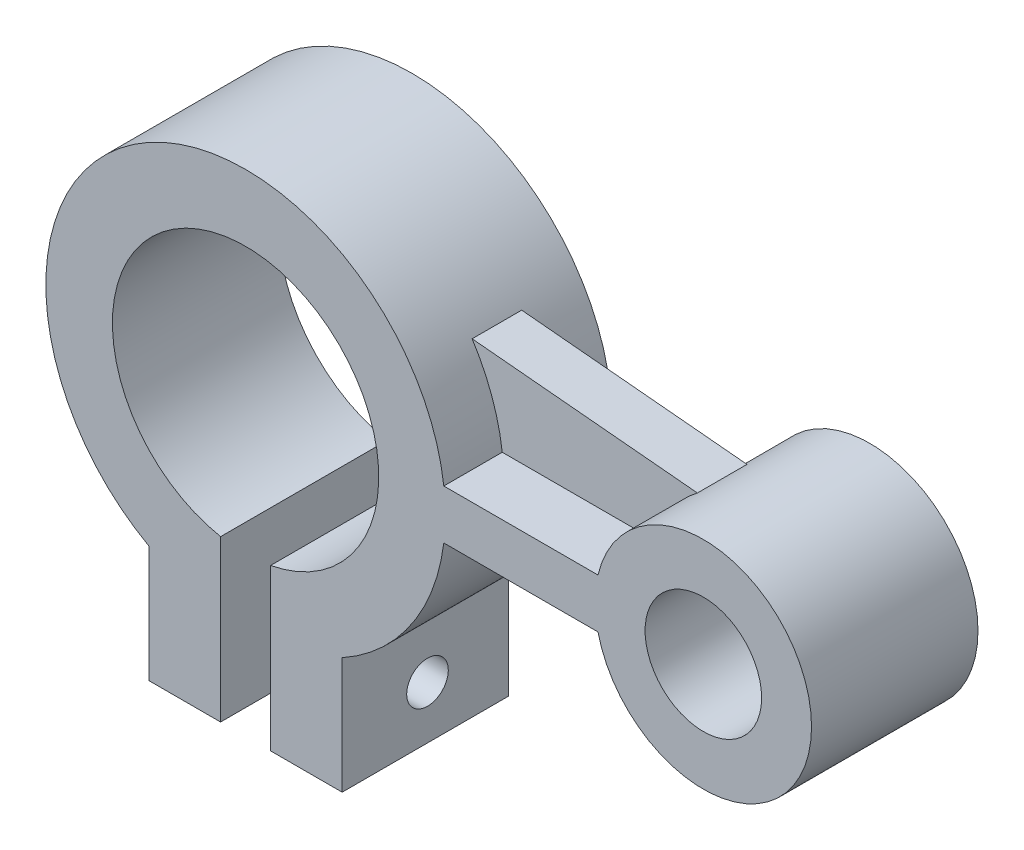
ISO-10303-21;
HEADER;
FILE_DESCRIPTION(('STEP AP214'),'2;1');
FILE_NAME('part.step','',(''),(''),'','','');
FILE_SCHEMA(('AUTOMOTIVE_DESIGN { 1 0 10303 214 1 1 1 1 }'));
ENDSEC;
DATA;
#1=APPLICATION_CONTEXT('core data for automotive mechanical design processes');
#2=APPLICATION_PROTOCOL_DEFINITION('international standard','automotive_design',2000,#1);
#3=PRODUCT_CONTEXT('',#1,'mechanical');
#4=PRODUCT('Part','Part','',(#3));
#5=PRODUCT_RELATED_PRODUCT_CATEGORY('part','',(#4));
#6=PRODUCT_DEFINITION_FORMATION('','',#4);
#7=PRODUCT_DEFINITION_CONTEXT('part definition',#1,'design');
#8=PRODUCT_DEFINITION('design','',#6,#7);
#9=PRODUCT_DEFINITION_SHAPE('','',#8);
#10=(LENGTH_UNIT() NAMED_UNIT(*) SI_UNIT(.MILLI.,.METRE.));
#11=(NAMED_UNIT(*) PLANE_ANGLE_UNIT() SI_UNIT($,.RADIAN.));
#12=(NAMED_UNIT(*) SI_UNIT($,.STERADIAN.) SOLID_ANGLE_UNIT());
#13=UNCERTAINTY_MEASURE_WITH_UNIT(LENGTH_MEASURE(1.E-05),#10,'distance_accuracy_value','');
#14=(GEOMETRIC_REPRESENTATION_CONTEXT(3) GLOBAL_UNCERTAINTY_ASSIGNED_CONTEXT((#13)) GLOBAL_UNIT_ASSIGNED_CONTEXT((#10,
#11,#12)) REPRESENTATION_CONTEXT('',''));
#15=CARTESIAN_POINT('',(0.,0.,0.));
#16=DIRECTION('',(0.,0.,1.));
#17=DIRECTION('',(1.,0.,0.));
#18=AXIS2_PLACEMENT_3D('',#15,#16,#17);
#19=CARTESIAN_POINT('',(0.,7.52347881235047,50.8));
#20=DIRECTION('',(0.,-1.,0.));
#21=DIRECTION('',(0.,0.,-1.));
#22=AXIS2_PLACEMENT_3D('',#19,#20,#21);
#23=PLANE('',#22);
#24=DIRECTION('',(-1.,0.,0.));
#25=VECTOR('',#24,1.);
#26=CARTESIAN_POINT('',(0.,7.52347881235047,17.8378913555939));
#27=LINE('',#26,#25);
#28=CARTESIAN_POINT('',(57.7043388095814,7.52347881235047,17.8378913555939));
#29=VERTEX_POINT('',#28);
#30=CARTESIAN_POINT('',(10.6497760884348,7.52347881235047,17.8378913555939));
#31=VERTEX_POINT('',#30);
#32=EDGE_CURVE('E310',#29,#31,#27,.T.);
#33=ORIENTED_EDGE('',*,*,#32,.F.);
#34=DIRECTION('',(0.,0.,-1.));
#35=VECTOR('',#34,1.);
#36=CARTESIAN_POINT('',(57.7043388095814,7.52347881235047,50.8));
#37=LINE('',#36,#35);
#38=CARTESIAN_POINT('',(57.7043388095814,7.52347881235047,0.));
#39=VERTEX_POINT('',#38);
#40=EDGE_CURVE('E237',#29,#39,#37,.T.);
#41=ORIENTED_EDGE('',*,*,#40,.T.);
#42=DIRECTION('',(-1.,0.,0.));
#43=VECTOR('',#42,1.);
#44=CARTESIAN_POINT('',(0.,7.52347881235047,0.));
#45=LINE('',#44,#43);
#46=CARTESIAN_POINT('',(10.6497760884348,7.52347881235047,0.));
#47=VERTEX_POINT('',#46);
#48=EDGE_CURVE('E270',#39,#47,#45,.T.);
#49=ORIENTED_EDGE('',*,*,#48,.T.);
#50=DIRECTION('',(0.,0.,-1.));
#51=VECTOR('',#50,1.);
#52=CARTESIAN_POINT('',(10.6497760884348,7.52347881235047,50.8));
#53=LINE('',#52,#51);
#54=EDGE_CURVE('E207',#31,#47,#53,.T.);
#55=ORIENTED_EDGE('',*,*,#54,.F.);
#56=EDGE_LOOP('',(#33,#41,#49,#55));
#57=FACE_BOUND('',#56,.T.);
#58=ADVANCED_FACE('F37',(#57),#23,.F.);
#59=DIRECTION('',(1.,0.,0.));
#60=VECTOR('',#59,1.);
#61=CARTESIAN_POINT('',(0.,7.52347881235047,32.9621086444061));
#62=LINE('',#61,#60);
#63=CARTESIAN_POINT('',(10.6497760884348,7.52347881235047,32.9621086444061));
#64=VERTEX_POINT('',#63);
#65=CARTESIAN_POINT('',(57.7043388095814,7.52347881235047,32.9621086444061));
#66=VERTEX_POINT('',#65);
#67=EDGE_CURVE('E192',#64,#66,#62,.T.);
#68=ORIENTED_EDGE('',*,*,#67,.F.);
#69=CARTESIAN_POINT('',(10.6497760884348,7.52347881235047,50.8));
#70=VERTEX_POINT('',#69);
#71=EDGE_CURVE('E204',#70,#64,#53,.T.);
#72=ORIENTED_EDGE('',*,*,#71,.F.);
#73=DIRECTION('',(-1.,0.,0.));
#74=VECTOR('',#73,1.);
#75=CARTESIAN_POINT('',(0.,7.52347881235047,50.8));
#76=LINE('',#75,#74);
#77=CARTESIAN_POINT('',(57.7043388095814,7.52347881235047,50.8));
#78=VERTEX_POINT('',#77);
#79=EDGE_CURVE('E304',#78,#70,#76,.T.);
#80=ORIENTED_EDGE('',*,*,#79,.F.);
#81=EDGE_CURVE('E235',#78,#66,#37,.T.);
#82=ORIENTED_EDGE('',*,*,#81,.T.);
#83=EDGE_LOOP('',(#68,#72,#80,#82));
#84=FACE_BOUND('',#83,.T.);
#85=ADVANCED_FACE('F407',(#84),#23,.F.);
#86=CARTESIAN_POINT('',(-49.844181184669,0.,50.8));
#87=DIRECTION('',(0.,0.,-1.));
#88=DIRECTION('',(-1.,0.,0.));
#89=AXIS2_PLACEMENT_3D('',#86,#87,#88);
#90=CYLINDRICAL_SURFACE('',#89,60.96);
#91=DIRECTION('',(0.,0.,-1.));
#92=VECTOR('',#91,1.);
#93=CARTESIAN_POINT('',(1.46045937437501,32.9234788123505,50.8));
#94=LINE('',#93,#92);
#95=CARTESIAN_POINT('',(1.46045937437501,32.9234788123505,17.8378913555939));
#96=VERTEX_POINT('',#95);
#97=CARTESIAN_POINT('',(1.46045937437501,32.9234788123505,32.9621086444061));
#98=VERTEX_POINT('',#97);
#99=EDGE_CURVE('E11',#96,#98,#94,.F.);
#100=ORIENTED_EDGE('',*,*,#99,.F.);
#101=CARTESIAN_POINT('',(-49.844181184669,0.,17.8378913555939));
#102=DIRECTION('',(0.,0.,1.));
#103=DIRECTION('',(1.,0.,0.));
#104=AXIS2_PLACEMENT_3D('',#101,#102,#103);
#105=CIRCLE('',#104,60.96);
#106=EDGE_CURVE('E57',#31,#96,#105,.T.);
#107=ORIENTED_EDGE('',*,*,#106,.F.);
#108=ORIENTED_EDGE('',*,*,#54,.T.);
#109=CARTESIAN_POINT('',(-49.844181184669,0.,0.));
#110=DIRECTION('',(0.,0.,1.));
#111=DIRECTION('',(1.,0.,0.));
#112=AXIS2_PLACEMENT_3D('',#109,#110,#111);
#113=CIRCLE('',#112,60.96);
#114=CARTESIAN_POINT('',(-79.3200634134683,-53.3600409185933,0.));
#115=VERTEX_POINT('',#114);
#116=EDGE_CURVE('E268',#47,#115,#113,.T.);
#117=ORIENTED_EDGE('',*,*,#116,.T.);
#118=DIRECTION('',(0.,0.,-1.));
#119=VECTOR('',#118,1.);
#120=CARTESIAN_POINT('',(-79.3200634134683,-53.3600409185933,50.8));
#121=LINE('',#120,#119);
#122=CARTESIAN_POINT('',(-79.3200634134683,-53.3600409185933,50.8));
#123=VERTEX_POINT('',#122);
#124=EDGE_CURVE('E210',#123,#115,#121,.T.);
#125=ORIENTED_EDGE('',*,*,#124,.F.);
#126=CARTESIAN_POINT('',(-49.844181184669,0.,50.8));
#127=DIRECTION('',(0.,0.,1.));
#128=DIRECTION('',(1.,0.,0.));
#129=AXIS2_PLACEMENT_3D('',#126,#127,#128);
#130=CIRCLE('',#129,60.96);
#131=EDGE_CURVE('E302',#70,#123,#130,.T.);
#132=ORIENTED_EDGE('',*,*,#131,.F.);
#133=ORIENTED_EDGE('',*,*,#71,.T.);
#134=CARTESIAN_POINT('',(-49.844181184669,0.,32.9621086444061));
#135=DIRECTION('',(0.,0.,-1.));
#136=DIRECTION('',(-1.,0.,0.));
#137=AXIS2_PLACEMENT_3D('',#134,#135,#136);
#138=CIRCLE('',#137,60.96);
#139=EDGE_CURVE('E322',#98,#64,#138,.T.);
#140=ORIENTED_EDGE('',*,*,#139,.F.);
#141=EDGE_LOOP('',(#100,#107,#108,#117,#125,#132,#133,#140));
#142=FACE_BOUND('',#141,.T.);
#143=ADVANCED_FACE('F399',(#142),#90,.T.);
#144=CARTESIAN_POINT('',(-49.844181184669,0.,50.8));
#145=DIRECTION('',(0.,0.,-1.));
#146=DIRECTION('',(-1.,0.,0.));
#147=AXIS2_PLACEMENT_3D('',#144,#145,#146);
#148=CYLINDRICAL_SURFACE('',#147,60.96);
#149=CARTESIAN_POINT('',(-49.844181184669,0.,17.8378913555939));
#150=DIRECTION('',(0.,0.,1.));
#151=DIRECTION('',(1.,0.,0.));
#152=AXIS2_PLACEMENT_3D('',#149,#150,#151);
#153=CIRCLE('',#152,60.96);
#154=CARTESIAN_POINT('',(8.43576039240802,-17.8765211876495,17.8378913555939));
#155=VERTEX_POINT('',#154);
#156=CARTESIAN_POINT('',(10.6497760884348,-7.52347881235047,17.8378913555939));
#157=VERTEX_POINT('',#156);
#158=EDGE_CURVE('E313',#155,#157,#153,.T.);
#159=ORIENTED_EDGE('',*,*,#158,.F.);
#160=DIRECTION('',(0.,0.,-1.));
#161=VECTOR('',#160,1.);
#162=CARTESIAN_POINT('',(8.43576039240802,-17.8765211876495,50.8));
#163=LINE('',#162,#161);
#164=CARTESIAN_POINT('',(8.43576039240802,-17.8765211876495,32.9621086444061));
#165=VERTEX_POINT('',#164);
#166=EDGE_CURVE('E325',#155,#165,#163,.F.);
#167=ORIENTED_EDGE('',*,*,#166,.T.);
#168=CARTESIAN_POINT('',(-49.844181184669,0.,32.9621086444061));
#169=DIRECTION('',(0.,0.,-1.));
#170=DIRECTION('',(-1.,0.,0.));
#171=AXIS2_PLACEMENT_3D('',#168,#169,#170);
#172=CIRCLE('',#171,60.96);
#173=CARTESIAN_POINT('',(10.6497760884348,-7.52347881235047,32.9621086444061));
#174=VERTEX_POINT('',#173);
#175=EDGE_CURVE('E318',#174,#165,#172,.T.);
#176=ORIENTED_EDGE('',*,*,#175,.F.);
#177=DIRECTION('',(0.,0.,-1.));
#178=VECTOR('',#177,1.);
#179=CARTESIAN_POINT('',(10.6497760884348,-7.52347881235047,50.8));
#180=LINE('',#179,#178);
#181=CARTESIAN_POINT('',(10.6497760884348,-7.52347881235047,50.8));
#182=VERTEX_POINT('',#181);
#183=EDGE_CURVE('E227',#182,#174,#180,.T.);
#184=ORIENTED_EDGE('',*,*,#183,.F.);
#185=CARTESIAN_POINT('',(-49.844181184669,0.,50.8));
#186=DIRECTION('',(0.,0.,1.));
#187=DIRECTION('',(1.,0.,0.));
#188=AXIS2_PLACEMENT_3D('',#185,#186,#187);
#189=CIRCLE('',#188,60.96);
#190=CARTESIAN_POINT('',(-20.3682989558698,-53.3600409185933,50.8));
#191=VERTEX_POINT('',#190);
#192=EDGE_CURVE('E281',#191,#182,#189,.T.);
#193=ORIENTED_EDGE('',*,*,#192,.F.);
#194=DIRECTION('',(0.,0.,-1.));
#195=VECTOR('',#194,1.);
#196=CARTESIAN_POINT('',(-20.3682989558698,-53.3600409185933,50.8));
#197=LINE('',#196,#195);
#198=CARTESIAN_POINT('',(-20.3682989558698,-53.3600409185933,0.));
#199=VERTEX_POINT('',#198);
#200=EDGE_CURVE('E225',#191,#199,#197,.T.);
#201=ORIENTED_EDGE('',*,*,#200,.T.);
#202=CARTESIAN_POINT('',(-49.844181184669,0.,0.));
#203=DIRECTION('',(0.,0.,1.));
#204=DIRECTION('',(1.,0.,0.));
#205=AXIS2_PLACEMENT_3D('',#202,#203,#204);
#206=CIRCLE('',#205,60.96);
#207=CARTESIAN_POINT('',(10.6497760884348,-7.52347881235047,0.));
#208=VERTEX_POINT('',#207);
#209=EDGE_CURVE('E244',#199,#208,#206,.T.);
#210=ORIENTED_EDGE('',*,*,#209,.T.);
#211=EDGE_CURVE('E230',#157,#208,#180,.T.);
#212=ORIENTED_EDGE('',*,*,#211,.F.);
#213=EDGE_LOOP('',(#159,#167,#176,#184,#193,#201,#210,#212));
#214=FACE_BOUND('',#213,.T.);
#215=ADVANCED_FACE('F367',(#214),#148,.T.);
#216=CARTESIAN_POINT('',(0.,-7.52347881235047,50.8));
#217=DIRECTION('',(0.,-1.,0.));
#218=DIRECTION('',(0.,0.,-1.));
#219=AXIS2_PLACEMENT_3D('',#216,#217,#218);
#220=PLANE('',#219);
#221=DIRECTION('',(0.,0.,-1.));
#222=VECTOR('',#221,1.);
#223=CARTESIAN_POINT('',(57.7043388095814,-7.52347881235047,50.8));
#224=LINE('',#223,#222);
#225=CARTESIAN_POINT('',(57.7043388095814,-7.52347881235047,17.8378913555939));
#226=VERTEX_POINT('',#225);
#227=CARTESIAN_POINT('',(57.7043388095814,-7.52347881235047,0.));
#228=VERTEX_POINT('',#227);
#229=EDGE_CURVE('E234',#226,#228,#224,.T.);
#230=ORIENTED_EDGE('',*,*,#229,.F.);
#231=DIRECTION('',(-1.,0.,0.));
#232=VECTOR('',#231,1.);
#233=CARTESIAN_POINT('',(0.,-7.52347881235047,17.8378913555939));
#234=LINE('',#233,#232);
#235=EDGE_CURVE('E315',#226,#157,#234,.T.);
#236=ORIENTED_EDGE('',*,*,#235,.T.);
#237=ORIENTED_EDGE('',*,*,#211,.T.);
#238=DIRECTION('',(-1.,0.,0.));
#239=VECTOR('',#238,1.);
#240=CARTESIAN_POINT('',(0.,-7.52347881235047,0.));
#241=LINE('',#240,#239);
#242=EDGE_CURVE('E241',#228,#208,#241,.T.);
#243=ORIENTED_EDGE('',*,*,#242,.F.);
#244=EDGE_LOOP('',(#230,#236,#237,#243));
#245=FACE_BOUND('',#244,.T.);
#246=ADVANCED_FACE('F419',(#245),#220,.T.);
#247=ORIENTED_EDGE('',*,*,#183,.T.);
#248=DIRECTION('',(1.,0.,0.));
#249=VECTOR('',#248,1.);
#250=CARTESIAN_POINT('',(0.,-7.52347881235047,32.9621086444061));
#251=LINE('',#250,#249);
#252=CARTESIAN_POINT('',(57.7043388095814,-7.52347881235047,32.9621086444061));
#253=VERTEX_POINT('',#252);
#254=EDGE_CURVE('E320',#174,#253,#251,.T.);
#255=ORIENTED_EDGE('',*,*,#254,.T.);
#256=CARTESIAN_POINT('',(57.7043388095814,-7.52347881235047,50.8));
#257=VERTEX_POINT('',#256);
#258=EDGE_CURVE('E231',#257,#253,#224,.T.);
#259=ORIENTED_EDGE('',*,*,#258,.F.);
#260=DIRECTION('',(-1.,0.,0.));
#261=VECTOR('',#260,1.);
#262=CARTESIAN_POINT('',(0.,-7.52347881235047,50.8));
#263=LINE('',#262,#261);
#264=EDGE_CURVE('E278',#257,#182,#263,.T.);
#265=ORIENTED_EDGE('',*,*,#264,.T.);
#266=EDGE_LOOP('',(#247,#255,#259,#265));
#267=FACE_BOUND('',#266,.T.);
#268=ADVANCED_FACE('F410',(#267),#220,.T.);
#269=CARTESIAN_POINT('',(89.8558188153309,0.,50.8));
#270=DIRECTION('',(0.,0.,-1.));
#271=DIRECTION('',(-1.,0.,0.));
#272=AXIS2_PLACEMENT_3D('',#269,#270,#271);
#273=CYLINDRICAL_SURFACE('',#272,33.02);
#274=CARTESIAN_POINT('',(89.8558188153309,0.,17.8378913555939));
#275=DIRECTION('',(0.,0.,1.));
#276=DIRECTION('',(1.,0.,0.));
#277=AXIS2_PLACEMENT_3D('',#274,#275,#276);
#278=CIRCLE('',#277,33.02);
#279=CARTESIAN_POINT('',(70.2103319318255,26.5400686719159,17.8378913555939));
#280=VERTEX_POINT('',#279);
#281=EDGE_CURVE('E45',#280,#29,#278,.T.);
#282=ORIENTED_EDGE('',*,*,#281,.F.);
#283=DIRECTION('',(0.,0.,-1.));
#284=VECTOR('',#283,1.);
#285=CARTESIAN_POINT('',(70.2103319318255,26.5400686719159,50.8));
#286=LINE('',#285,#284);
#287=CARTESIAN_POINT('',(70.2103319318255,26.5400686719159,32.9621086444061));
#288=VERTEX_POINT('',#287);
#289=EDGE_CURVE('E172',#288,#280,#286,.T.);
#290=ORIENTED_EDGE('',*,*,#289,.F.);
#291=CARTESIAN_POINT('',(89.8558188153309,0.,32.9621086444061));
#292=DIRECTION('',(0.,0.,-1.));
#293=DIRECTION('',(-1.,0.,0.));
#294=AXIS2_PLACEMENT_3D('',#291,#292,#293);
#295=CIRCLE('',#294,33.02);
#296=EDGE_CURVE('E185',#66,#288,#295,.T.);
#297=ORIENTED_EDGE('',*,*,#296,.F.);
#298=ORIENTED_EDGE('',*,*,#81,.F.);
#299=CARTESIAN_POINT('',(89.8558188153309,0.,50.8));
#300=DIRECTION('',(0.,0.,1.));
#301=DIRECTION('',(1.,0.,0.));
#302=AXIS2_PLACEMENT_3D('',#299,#300,#301);
#303=CIRCLE('',#302,33.02);
#304=EDGE_CURVE('E276',#257,#78,#303,.T.);
#305=ORIENTED_EDGE('',*,*,#304,.F.);
#306=ORIENTED_EDGE('',*,*,#258,.T.);
#307=CARTESIAN_POINT('',(62.0934271635385,-17.8765211876495,32.9621086444061));
#308=VERTEX_POINT('',#307);
#309=EDGE_CURVE('E194',#308,#253,#295,.T.);
#310=ORIENTED_EDGE('',*,*,#309,.F.);
#311=DIRECTION('',(0.,0.,-1.));
#312=VECTOR('',#311,1.);
#313=CARTESIAN_POINT('',(62.0934271635385,-17.8765211876495,50.8));
#314=LINE('',#313,#312);
#315=CARTESIAN_POINT('',(62.0934271635385,-17.8765211876495,17.8378913555939));
#316=VERTEX_POINT('',#315);
#317=EDGE_CURVE('E197',#308,#316,#314,.T.);
#318=ORIENTED_EDGE('',*,*,#317,.T.);
#319=EDGE_CURVE('E189',#226,#316,#278,.T.);
#320=ORIENTED_EDGE('',*,*,#319,.F.);
#321=ORIENTED_EDGE('',*,*,#229,.T.);
#322=CARTESIAN_POINT('',(89.8558188153309,0.,0.));
#323=DIRECTION('',(0.,0.,1.));
#324=DIRECTION('',(1.,0.,0.));
#325=AXIS2_PLACEMENT_3D('',#322,#323,#324);
#326=CIRCLE('',#325,33.02);
#327=EDGE_CURVE('E238',#228,#39,#326,.T.);
#328=ORIENTED_EDGE('',*,*,#327,.T.);
#329=ORIENTED_EDGE('',*,*,#40,.F.);
#330=EDGE_LOOP('',(#282,#290,#297,#298,#305,#306,#310,#318,#320,#321,#328,#329));
#331=FACE_BOUND('',#330,.T.);
#332=ADVANCED_FACE('F183',(#331),#273,.T.);
#333=CARTESIAN_POINT('',(-79.3200634134683,0.,50.8));
#334=DIRECTION('',(1.,0.,0.));
#335=DIRECTION('',(0.,0.,-1.));
#336=AXIS2_PLACEMENT_3D('',#333,#334,#335);
#337=PLANE('',#336);
#338=CARTESIAN_POINT('',(-79.3200634134683,-72.866633353911,24.7622273671606));
#339=DIRECTION('',(1.,0.,0.));
#340=DIRECTION('',(0.,0.,-1.));
#341=AXIS2_PLACEMENT_3D('',#338,#339,#340);
#342=CIRCLE('',#341,6.35);
#343=CARTESIAN_POINT('',(-79.3200634134683,-72.866633353911,18.4122273671606));
#344=VERTEX_POINT('',#343);
#345=EDGE_CURVE('E179',#344,#344,#342,.T.);
#346=ORIENTED_EDGE('',*,*,#345,.T.);
#347=EDGE_LOOP('',(#346));
#348=FACE_BOUND('',#347,.T.);
#349=DIRECTION('',(0.,-1.,0.));
#350=VECTOR('',#349,1.);
#351=CARTESIAN_POINT('',(-79.3200634134683,0.,0.));
#352=LINE('',#351,#350);
#353=CARTESIAN_POINT('',(-79.3200634134683,-88.9200409185933,0.));
#354=VERTEX_POINT('',#353);
#355=EDGE_CURVE('E265',#115,#354,#352,.T.);
#356=ORIENTED_EDGE('',*,*,#355,.T.);
#357=DIRECTION('',(0.,0.,-1.));
#358=VECTOR('',#357,1.);
#359=CARTESIAN_POINT('',(-79.3200634134683,-88.9200409185933,50.8));
#360=LINE('',#359,#358);
#361=CARTESIAN_POINT('',(-79.3200634134683,-88.9200409185933,50.8));
#362=VERTEX_POINT('',#361);
#363=EDGE_CURVE('E213',#362,#354,#360,.T.);
#364=ORIENTED_EDGE('',*,*,#363,.F.);
#365=DIRECTION('',(0.,-1.,0.));
#366=VECTOR('',#365,1.);
#367=CARTESIAN_POINT('',(-79.3200634134683,0.,50.8));
#368=LINE('',#367,#366);
#369=EDGE_CURVE('E300',#123,#362,#368,.T.);
#370=ORIENTED_EDGE('',*,*,#369,.F.);
#371=ORIENTED_EDGE('',*,*,#124,.T.);
#372=EDGE_LOOP('',(#356,#364,#370,#371));
#373=FACE_BOUND('',#372,.T.);
#374=ADVANCED_FACE('F397',(#348,#373),#337,.F.);
#375=CARTESIAN_POINT('',(0.,-88.9200409185933,50.8));
#376=DIRECTION('',(0.,-1.,0.));
#377=DIRECTION('',(0.,0.,-1.));
#378=AXIS2_PLACEMENT_3D('',#375,#376,#377);
#379=PLANE('',#378);
#380=DIRECTION('',(-1.,0.,0.));
#381=VECTOR('',#380,1.);
#382=CARTESIAN_POINT('',(0.,-88.9200409185933,0.));
#383=LINE('',#382,#381);
#384=CARTESIAN_POINT('',(-57.4705375175018,-88.9200409185933,0.));
#385=VERTEX_POINT('',#384);
#386=EDGE_CURVE('E262',#385,#354,#383,.T.);
#387=ORIENTED_EDGE('',*,*,#386,.F.);
#388=DIRECTION('',(0.,0.,-1.));
#389=VECTOR('',#388,1.);
#390=CARTESIAN_POINT('',(-57.4705375175018,-88.9200409185933,50.8));
#391=LINE('',#390,#389);
#392=CARTESIAN_POINT('',(-57.4705375175018,-88.9200409185933,50.8));
#393=VERTEX_POINT('',#392);
#394=EDGE_CURVE('E215',#393,#385,#391,.T.);
#395=ORIENTED_EDGE('',*,*,#394,.F.);
#396=DIRECTION('',(-1.,0.,0.));
#397=VECTOR('',#396,1.);
#398=CARTESIAN_POINT('',(0.,-88.9200409185933,50.8));
#399=LINE('',#398,#397);
#400=EDGE_CURVE('E297',#393,#362,#399,.T.);
#401=ORIENTED_EDGE('',*,*,#400,.T.);
#402=ORIENTED_EDGE('',*,*,#363,.T.);
#403=EDGE_LOOP('',(#387,#395,#401,#402));
#404=FACE_BOUND('',#403,.T.);
#405=ADVANCED_FACE('F392',(#404),#379,.T.);
#406=CARTESIAN_POINT('',(-57.4705375175018,0.,50.8));
#407=DIRECTION('',(1.,0.,0.));
#408=DIRECTION('',(0.,0.,-1.));
#409=AXIS2_PLACEMENT_3D('',#406,#407,#408);
#410=PLANE('',#409);
#411=CARTESIAN_POINT('',(-57.4705375175018,-72.866633353911,24.7622273671606));
#412=DIRECTION('',(1.,0.,0.));
#413=DIRECTION('',(0.,0.,-1.));
#414=AXIS2_PLACEMENT_3D('',#411,#412,#413);
#415=CIRCLE('',#414,6.35);
#416=CARTESIAN_POINT('',(-57.4705375175018,-72.866633353911,18.4122273671606));
#417=VERTEX_POINT('',#416);
#418=EDGE_CURVE('E336',#417,#417,#415,.T.);
#419=ORIENTED_EDGE('',*,*,#418,.F.);
#420=EDGE_LOOP('',(#419));
#421=FACE_BOUND('',#420,.T.);
#422=DIRECTION('',(0.,-1.,0.));
#423=VECTOR('',#422,1.);
#424=CARTESIAN_POINT('',(-57.4705375175018,0.,0.));
#425=LINE('',#424,#423);
#426=CARTESIAN_POINT('',(-57.4705375175018,-39.9180196037411,0.));
#427=VERTEX_POINT('',#426);
#428=EDGE_CURVE('E259',#427,#385,#425,.T.);
#429=ORIENTED_EDGE('',*,*,#428,.F.);
#430=DIRECTION('',(0.,0.,-1.));
#431=VECTOR('',#430,1.);
#432=CARTESIAN_POINT('',(-57.4705375175018,-39.9180196037411,50.8));
#433=LINE('',#432,#431);
#434=CARTESIAN_POINT('',(-57.4705375175018,-39.9180196037411,50.8));
#435=VERTEX_POINT('',#434);
#436=EDGE_CURVE('E217',#435,#427,#433,.T.);
#437=ORIENTED_EDGE('',*,*,#436,.F.);
#438=DIRECTION('',(0.,-1.,0.));
#439=VECTOR('',#438,1.);
#440=CARTESIAN_POINT('',(-57.4705375175018,0.,50.8));
#441=LINE('',#440,#439);
#442=EDGE_CURVE('E294',#435,#393,#441,.T.);
#443=ORIENTED_EDGE('',*,*,#442,.T.);
#444=ORIENTED_EDGE('',*,*,#394,.T.);
#445=EDGE_LOOP('',(#429,#437,#443,#444));
#446=FACE_BOUND('',#445,.T.);
#447=ADVANCED_FACE('F387',(#421,#446),#410,.T.);
#448=CARTESIAN_POINT('',(-49.844181184669,0.,50.8));
#449=DIRECTION('',(0.,0.,-1.));
#450=DIRECTION('',(-1.,0.,0.));
#451=AXIS2_PLACEMENT_3D('',#448,#449,#450);
#452=CYLINDRICAL_SURFACE('',#451,40.64);
#453=CARTESIAN_POINT('',(-49.844181184669,0.,0.));
#454=DIRECTION('',(0.,0.,1.));
#455=DIRECTION('',(1.,0.,0.));
#456=AXIS2_PLACEMENT_3D('',#453,#454,#455);
#457=CIRCLE('',#456,40.64);
#458=CARTESIAN_POINT('',(-42.2178248518363,-39.9180196037411,0.));
#459=VERTEX_POINT('',#458);
#460=EDGE_CURVE('E256',#459,#427,#457,.T.);
#461=ORIENTED_EDGE('',*,*,#460,.F.);
#462=DIRECTION('',(0.,0.,-1.));
#463=VECTOR('',#462,1.);
#464=CARTESIAN_POINT('',(-42.2178248518363,-39.9180196037411,50.8));
#465=LINE('',#464,#463);
#466=CARTESIAN_POINT('',(-42.2178248518363,-39.9180196037411,50.8));
#467=VERTEX_POINT('',#466);
#468=EDGE_CURVE('E219',#467,#459,#465,.T.);
#469=ORIENTED_EDGE('',*,*,#468,.F.);
#470=CARTESIAN_POINT('',(-49.844181184669,0.,50.8));
#471=DIRECTION('',(0.,0.,1.));
#472=DIRECTION('',(1.,0.,0.));
#473=AXIS2_PLACEMENT_3D('',#470,#471,#472);
#474=CIRCLE('',#473,40.64);
#475=EDGE_CURVE('E291',#467,#435,#474,.T.);
#476=ORIENTED_EDGE('',*,*,#475,.T.);
#477=ORIENTED_EDGE('',*,*,#436,.T.);
#478=EDGE_LOOP('',(#461,#469,#476,#477));
#479=FACE_BOUND('',#478,.T.);
#480=ADVANCED_FACE('F383',(#479),#452,.F.);
#481=CARTESIAN_POINT('',(-42.2178248518363,0.,50.8));
#482=DIRECTION('',(1.,0.,0.));
#483=DIRECTION('',(0.,0.,-1.));
#484=AXIS2_PLACEMENT_3D('',#481,#482,#483);
#485=PLANE('',#484);
#486=CARTESIAN_POINT('',(-42.2178248518363,-72.866633353911,24.7622273671606));
#487=DIRECTION('',(1.,0.,0.));
#488=DIRECTION('',(0.,0.,-1.));
#489=AXIS2_PLACEMENT_3D('',#486,#487,#488);
#490=CIRCLE('',#489,6.35);
#491=CARTESIAN_POINT('',(-42.2178248518363,-72.866633353911,18.4122273671606));
#492=VERTEX_POINT('',#491);
#493=EDGE_CURVE('E339',#492,#492,#490,.T.);
#494=ORIENTED_EDGE('',*,*,#493,.T.);
#495=EDGE_LOOP('',(#494));
#496=FACE_BOUND('',#495,.T.);
#497=DIRECTION('',(0.,-1.,0.));
#498=VECTOR('',#497,1.);
#499=CARTESIAN_POINT('',(-42.2178248518363,0.,0.));
#500=LINE('',#499,#498);
#501=CARTESIAN_POINT('',(-42.2178248518363,-88.9200409185933,0.));
#502=VERTEX_POINT('',#501);
#503=EDGE_CURVE('E253',#459,#502,#500,.T.);
#504=ORIENTED_EDGE('',*,*,#503,.T.);
#505=DIRECTION('',(0.,0.,-1.));
#506=VECTOR('',#505,1.);
#507=CARTESIAN_POINT('',(-42.2178248518363,-88.9200409185933,50.8));
#508=LINE('',#507,#506);
#509=CARTESIAN_POINT('',(-42.2178248518363,-88.9200409185933,50.8));
#510=VERTEX_POINT('',#509);
#511=EDGE_CURVE('E221',#510,#502,#508,.T.);
#512=ORIENTED_EDGE('',*,*,#511,.F.);
#513=DIRECTION('',(0.,-1.,0.));
#514=VECTOR('',#513,1.);
#515=CARTESIAN_POINT('',(-42.2178248518363,0.,50.8));
#516=LINE('',#515,#514);
#517=EDGE_CURVE('E289',#467,#510,#516,.T.);
#518=ORIENTED_EDGE('',*,*,#517,.F.);
#519=ORIENTED_EDGE('',*,*,#468,.T.);
#520=EDGE_LOOP('',(#504,#512,#518,#519));
#521=FACE_BOUND('',#520,.T.);
#522=ADVANCED_FACE('F380',(#496,#521),#485,.F.);
#523=CARTESIAN_POINT('',(0.,-88.9200409185933,50.8));
#524=DIRECTION('',(0.,-1.,0.));
#525=DIRECTION('',(0.,0.,-1.));
#526=AXIS2_PLACEMENT_3D('',#523,#524,#525);
#527=PLANE('',#526);
#528=DIRECTION('',(-1.,0.,0.));
#529=VECTOR('',#528,1.);
#530=CARTESIAN_POINT('',(0.,-88.9200409185933,0.));
#531=LINE('',#530,#529);
#532=CARTESIAN_POINT('',(-20.3682989558698,-88.9200409185933,0.));
#533=VERTEX_POINT('',#532);
#534=EDGE_CURVE('E250',#533,#502,#531,.T.);
#535=ORIENTED_EDGE('',*,*,#534,.F.);
#536=DIRECTION('',(0.,0.,-1.));
#537=VECTOR('',#536,1.);
#538=CARTESIAN_POINT('',(-20.3682989558698,-88.9200409185933,50.8));
#539=LINE('',#538,#537);
#540=CARTESIAN_POINT('',(-20.3682989558698,-88.9200409185933,50.8));
#541=VERTEX_POINT('',#540);
#542=EDGE_CURVE('E223',#541,#533,#539,.T.);
#543=ORIENTED_EDGE('',*,*,#542,.F.);
#544=DIRECTION('',(-1.,0.,0.));
#545=VECTOR('',#544,1.);
#546=CARTESIAN_POINT('',(0.,-88.9200409185933,50.8));
#547=LINE('',#546,#545);
#548=EDGE_CURVE('E286',#541,#510,#547,.T.);
#549=ORIENTED_EDGE('',*,*,#548,.T.);
#550=ORIENTED_EDGE('',*,*,#511,.T.);
#551=EDGE_LOOP('',(#535,#543,#549,#550));
#552=FACE_BOUND('',#551,.T.);
#553=ADVANCED_FACE('F352',(#552),#527,.T.);
#554=CARTESIAN_POINT('',(-20.3682989558698,0.,50.8));
#555=DIRECTION('',(1.,0.,0.));
#556=DIRECTION('',(0.,1.,0.));
#557=AXIS2_PLACEMENT_3D('',#554,#555,#556);
#558=PLANE('',#557);
#559=CARTESIAN_POINT('',(-20.3682989558698,-72.866633353911,24.7622273671606));
#560=DIRECTION('',(1.,0.,0.));
#561=DIRECTION('',(0.,1.,0.));
#562=AXIS2_PLACEMENT_3D('',#559,#560,#561);
#563=CIRCLE('',#562,6.35);
#564=CARTESIAN_POINT('',(-20.3682989558698,-66.516633353911,24.7622273671606));
#565=VERTEX_POINT('',#564);
#566=EDGE_CURVE('E342',#565,#565,#563,.T.);
#567=ORIENTED_EDGE('',*,*,#566,.F.);
#568=EDGE_LOOP('',(#567));
#569=FACE_BOUND('',#568,.T.);
#570=DIRECTION('',(0.,-1.,0.));
#571=VECTOR('',#570,1.);
#572=CARTESIAN_POINT('',(-20.3682989558698,0.,0.));
#573=LINE('',#572,#571);
#574=EDGE_CURVE('E247',#199,#533,#573,.T.);
#575=ORIENTED_EDGE('',*,*,#574,.F.);
#576=ORIENTED_EDGE('',*,*,#200,.F.);
#577=DIRECTION('',(0.,-1.,0.));
#578=VECTOR('',#577,1.);
#579=CARTESIAN_POINT('',(-20.3682989558698,0.,50.8));
#580=LINE('',#579,#578);
#581=EDGE_CURVE('E283',#191,#541,#580,.T.);
#582=ORIENTED_EDGE('',*,*,#581,.T.);
#583=ORIENTED_EDGE('',*,*,#542,.T.);
#584=EDGE_LOOP('',(#575,#576,#582,#583));
#585=FACE_BOUND('',#584,.T.);
#586=ADVANCED_FACE('F349',(#569,#585),#558,.T.);
#587=CARTESIAN_POINT('',(89.8558188153309,0.,50.8));
#588=DIRECTION('',(0.,0.,-1.));
#589=DIRECTION('',(-1.,0.,0.));
#590=AXIS2_PLACEMENT_3D('',#587,#588,#589);
#591=CYLINDRICAL_SURFACE('',#590,17.78);
#592=CARTESIAN_POINT('',(89.8558188153309,0.,50.8));
#593=DIRECTION('',(0.,0.,1.));
#594=DIRECTION('',(1.,0.,0.));
#595=AXIS2_PLACEMENT_3D('',#592,#593,#594);
#596=CIRCLE('',#595,17.78);
#597=CARTESIAN_POINT('',(107.635818815331,0.,50.8));
#598=VERTEX_POINT('',#597);
#599=EDGE_CURVE('E240',#598,#598,#596,.T.);
#600=ORIENTED_EDGE('',*,*,#599,.T.);
#601=EDGE_LOOP('',(#600));
#602=FACE_BOUND('',#601,.T.);
#603=CARTESIAN_POINT('',(89.8558188153309,0.,0.));
#604=DIRECTION('',(0.,0.,1.));
#605=DIRECTION('',(1.,0.,0.));
#606=AXIS2_PLACEMENT_3D('',#603,#604,#605);
#607=CIRCLE('',#606,17.78);
#608=CARTESIAN_POINT('',(107.635818815331,0.,0.));
#609=VERTEX_POINT('',#608);
#610=EDGE_CURVE('E273',#609,#609,#607,.T.);
#611=ORIENTED_EDGE('',*,*,#610,.F.);
#612=EDGE_LOOP('',(#611));
#613=FACE_BOUND('',#612,.T.);
#614=ADVANCED_FACE('F39',(#602,#613),#591,.F.);
#615=CARTESIAN_POINT('',(0.,0.,50.8));
#616=DIRECTION('',(0.,0.,1.));
#617=DIRECTION('',(1.,0.,0.));
#618=AXIS2_PLACEMENT_3D('',#615,#616,#617);
#619=PLANE('',#618);
#620=ORIENTED_EDGE('',*,*,#599,.F.);
#621=EDGE_LOOP('',(#620));
#622=FACE_BOUND('',#621,.T.);
#623=ORIENTED_EDGE('',*,*,#79,.T.);
#624=ORIENTED_EDGE('',*,*,#131,.T.);
#625=ORIENTED_EDGE('',*,*,#369,.T.);
#626=ORIENTED_EDGE('',*,*,#400,.F.);
#627=ORIENTED_EDGE('',*,*,#442,.F.);
#628=ORIENTED_EDGE('',*,*,#475,.F.);
#629=ORIENTED_EDGE('',*,*,#517,.T.);
#630=ORIENTED_EDGE('',*,*,#548,.F.);
#631=ORIENTED_EDGE('',*,*,#581,.F.);
#632=ORIENTED_EDGE('',*,*,#192,.T.);
#633=ORIENTED_EDGE('',*,*,#264,.F.);
#634=ORIENTED_EDGE('',*,*,#304,.T.);
#635=EDGE_LOOP('',(#623,#624,#625,#626,#627,#628,#629,#630,#631,#632,#633,#634));
#636=FACE_BOUND('',#635,.T.);
#637=ADVANCED_FACE('F374',(#622,#636),#619,.T.);
#638=CARTESIAN_POINT('',(0.,0.,0.));
#639=DIRECTION('',(0.,0.,1.));
#640=DIRECTION('',(1.,0.,0.));
#641=AXIS2_PLACEMENT_3D('',#638,#639,#640);
#642=PLANE('',#641);
#643=ORIENTED_EDGE('',*,*,#610,.T.);
#644=EDGE_LOOP('',(#643));
#645=FACE_BOUND('',#644,.T.);
#646=ORIENTED_EDGE('',*,*,#48,.F.);
#647=ORIENTED_EDGE('',*,*,#327,.F.);
#648=ORIENTED_EDGE('',*,*,#242,.T.);
#649=ORIENTED_EDGE('',*,*,#209,.F.);
#650=ORIENTED_EDGE('',*,*,#574,.T.);
#651=ORIENTED_EDGE('',*,*,#534,.T.);
#652=ORIENTED_EDGE('',*,*,#503,.F.);
#653=ORIENTED_EDGE('',*,*,#460,.T.);
#654=ORIENTED_EDGE('',*,*,#428,.T.);
#655=ORIENTED_EDGE('',*,*,#386,.T.);
#656=ORIENTED_EDGE('',*,*,#355,.F.);
#657=ORIENTED_EDGE('',*,*,#116,.F.);
#658=EDGE_LOOP('',(#646,#647,#648,#649,#650,#651,#652,#653,#654,#655,#656,#657));
#659=FACE_BOUND('',#658,.T.);
#660=ADVANCED_FACE('F360',(#645,#659),#642,.F.);
#661=CARTESIAN_POINT('',(0.,-17.8765211876495,0.));
#662=DIRECTION('',(0.,-1.,0.));
#663=DIRECTION('',(0.,0.,-1.));
#664=AXIS2_PLACEMENT_3D('',#661,#662,#663);
#665=PLANE('',#664);
#666=ORIENTED_EDGE('',*,*,#166,.F.);
#667=DIRECTION('',(-1.,0.,0.));
#668=VECTOR('',#667,1.);
#669=CARTESIAN_POINT('',(-3.65229833564684,-17.8765211876495,17.8378913555939));
#670=LINE('',#669,#668);
#671=EDGE_CURVE('E330',#316,#155,#670,.T.);
#672=ORIENTED_EDGE('',*,*,#671,.F.);
#673=ORIENTED_EDGE('',*,*,#317,.F.);
#674=DIRECTION('',(1.,0.,0.));
#675=VECTOR('',#674,1.);
#676=CARTESIAN_POINT('',(-3.65229833564684,-17.8765211876495,32.9621086444061));
#677=LINE('',#676,#675);
#678=EDGE_CURVE('E328',#165,#308,#677,.T.);
#679=ORIENTED_EDGE('',*,*,#678,.F.);
#680=EDGE_LOOP('',(#666,#672,#673,#679));
#681=FACE_BOUND('',#680,.T.);
#682=ADVANCED_FACE('F414',(#681),#665,.T.);
#683=CARTESIAN_POINT('',(-3.65229833564684,32.9234788123505,32.9621086444061));
#684=DIRECTION('',(0.,0.,-1.));
#685=DIRECTION('',(-1.,0.,0.));
#686=AXIS2_PLACEMENT_3D('',#683,#684,#685);
#687=PLANE('',#686);
#688=ORIENTED_EDGE('',*,*,#254,.F.);
#689=ORIENTED_EDGE('',*,*,#175,.T.);
#690=ORIENTED_EDGE('',*,*,#678,.T.);
#691=ORIENTED_EDGE('',*,*,#309,.T.);
#692=EDGE_LOOP('',(#688,#689,#690,#691));
#693=FACE_BOUND('',#692,.T.);
#694=ADVANCED_FACE('F411',(#693),#687,.F.);
#695=CARTESIAN_POINT('',(-3.65229833564684,32.9234788123505,17.8378913555939));
#696=DIRECTION('',(0.,0.,1.));
#697=DIRECTION('',(1.,0.,0.));
#698=AXIS2_PLACEMENT_3D('',#695,#696,#697);
#699=PLANE('',#698);
#700=ORIENTED_EDGE('',*,*,#671,.T.);
#701=ORIENTED_EDGE('',*,*,#158,.T.);
#702=ORIENTED_EDGE('',*,*,#235,.F.);
#703=ORIENTED_EDGE('',*,*,#319,.T.);
#704=EDGE_LOOP('',(#700,#701,#702,#703));
#705=FACE_BOUND('',#704,.T.);
#706=ADVANCED_FACE('F416',(#705),#699,.F.);
#707=ORIENTED_EDGE('',*,*,#106,.T.);
#708=DIRECTION('',(0.995717132121616,-0.0924521108439597,0.));
#709=VECTOR('',#708,1.);
#710=CARTESIAN_POINT('',(-3.60859758721059,33.3941396064339,17.8378913555939));
#711=LINE('',#710,#709);
#712=EDGE_CURVE('E178',#96,#280,#711,.T.);
#713=ORIENTED_EDGE('',*,*,#712,.T.);
#714=ORIENTED_EDGE('',*,*,#281,.T.);
#715=ORIENTED_EDGE('',*,*,#32,.T.);
#716=EDGE_LOOP('',(#707,#713,#714,#715));
#717=FACE_BOUND('',#716,.T.);
#718=ADVANCED_FACE('F403',(#717),#699,.F.);
#719=ORIENTED_EDGE('',*,*,#296,.T.);
#720=DIRECTION('',(0.995717132121616,-0.0924521108439597,0.));
#721=VECTOR('',#720,1.);
#722=CARTESIAN_POINT('',(70.2103319318255,26.5400686719159,32.9621086444061));
#723=LINE('',#722,#721);
#724=EDGE_CURVE('E169',#98,#288,#723,.T.);
#725=ORIENTED_EDGE('',*,*,#724,.F.);
#726=ORIENTED_EDGE('',*,*,#139,.T.);
#727=ORIENTED_EDGE('',*,*,#67,.T.);
#728=EDGE_LOOP('',(#719,#725,#726,#727));
#729=FACE_BOUND('',#728,.T.);
#730=ADVANCED_FACE('F191',(#729),#687,.F.);
#731=CARTESIAN_POINT('',(70.2103319318255,26.5400686719159,-17.8378913555939));
#732=DIRECTION('',(-0.0924521108439597,-0.995717132121616,0.));
#733=DIRECTION('',(0.995717132121616,-0.0924521108439597,0.));
#734=AXIS2_PLACEMENT_3D('',#731,#732,#733);
#735=PLANE('',#734);
#736=ORIENTED_EDGE('',*,*,#99,.T.);
#737=ORIENTED_EDGE('',*,*,#724,.T.);
#738=ORIENTED_EDGE('',*,*,#289,.T.);
#739=ORIENTED_EDGE('',*,*,#712,.F.);
#740=EDGE_LOOP('',(#736,#737,#738,#739));
#741=FACE_BOUND('',#740,.T.);
#742=ADVANCED_FACE('F171',(#741),#735,.F.);
#743=CARTESIAN_POINT('',(-83.8682989558698,-72.866633353911,24.7622273671606));
#744=DIRECTION('',(1.,0.,0.));
#745=DIRECTION('',(0.,1.,0.));
#746=AXIS2_PLACEMENT_3D('',#743,#744,#745);
#747=CYLINDRICAL_SURFACE('',#746,6.35);
#748=ORIENTED_EDGE('',*,*,#566,.T.);
#749=EDGE_LOOP('',(#748));
#750=FACE_BOUND('',#749,.T.);
#751=ORIENTED_EDGE('',*,*,#493,.F.);
#752=EDGE_LOOP('',(#751));
#753=FACE_BOUND('',#752,.T.);
#754=ADVANCED_FACE('F346',(#750,#753),#747,.F.);
#755=ORIENTED_EDGE('',*,*,#418,.T.);
#756=EDGE_LOOP('',(#755));
#757=FACE_BOUND('',#756,.T.);
#758=ORIENTED_EDGE('',*,*,#345,.F.);
#759=EDGE_LOOP('',(#758));
#760=FACE_BOUND('',#759,.T.);
#761=ADVANCED_FACE('F522',(#757,#760),#747,.F.);
#762=CLOSED_SHELL('',(#58,#85,#143,#215,#246,#268,#332,#374,#405,#447,#480,#522,#553,#586,#614,
#637,#660,#682,#694,#706,#718,#730,#742,#754,#761));
#763=MANIFOLD_SOLID_BREP('B2',#762);
#764=ADVANCED_BREP_SHAPE_REPRESENTATION('',(#18,#763),#14);
#765=SHAPE_DEFINITION_REPRESENTATION(#9,#764);
ENDSEC;
END-ISO-10303-21;
